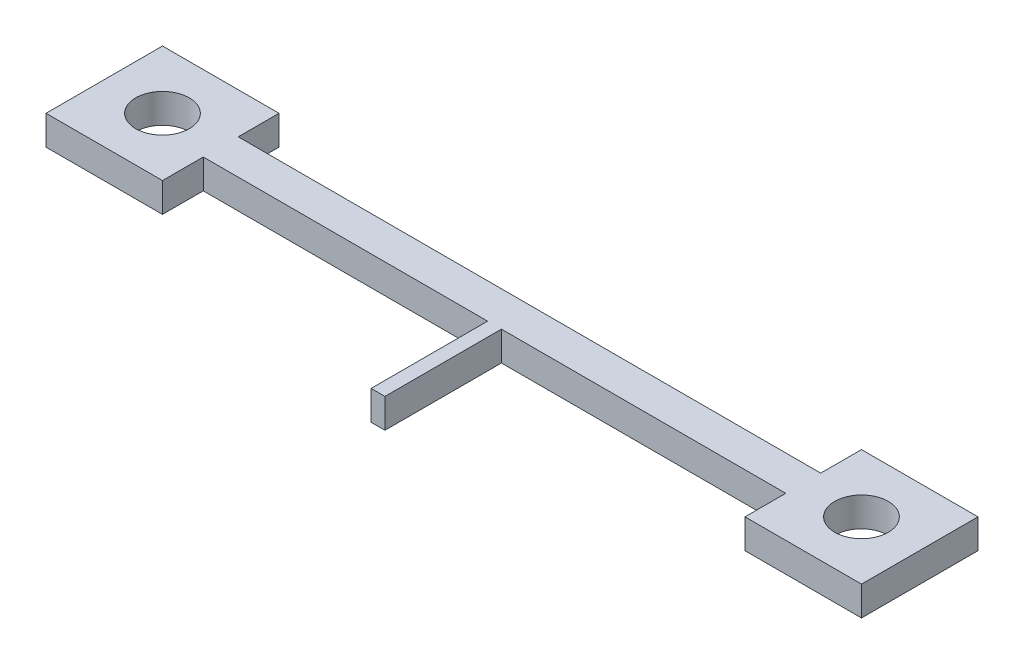
ISO-10303-21;
HEADER;
FILE_DESCRIPTION(('STEP AP214'),'2;1');
FILE_NAME('part.step','',(''),(''),'','','');
FILE_SCHEMA(('AUTOMOTIVE_DESIGN { 1 0 10303 214 1 1 1 1 }'));
ENDSEC;
DATA;
#1=APPLICATION_CONTEXT('core data for automotive mechanical design processes');
#2=APPLICATION_PROTOCOL_DEFINITION('international standard','automotive_design',2000,#1);
#3=PRODUCT_CONTEXT('',#1,'mechanical');
#4=PRODUCT('Part','Part','',(#3));
#5=PRODUCT_RELATED_PRODUCT_CATEGORY('part','',(#4));
#6=PRODUCT_DEFINITION_FORMATION('','',#4);
#7=PRODUCT_DEFINITION_CONTEXT('part definition',#1,'design');
#8=PRODUCT_DEFINITION('design','',#6,#7);
#9=PRODUCT_DEFINITION_SHAPE('','',#8);
#10=(LENGTH_UNIT() NAMED_UNIT(*) SI_UNIT(.MILLI.,.METRE.));
#11=(NAMED_UNIT(*) PLANE_ANGLE_UNIT() SI_UNIT($,.RADIAN.));
#12=(NAMED_UNIT(*) SI_UNIT($,.STERADIAN.) SOLID_ANGLE_UNIT());
#13=UNCERTAINTY_MEASURE_WITH_UNIT(LENGTH_MEASURE(1.E-05),#10,'distance_accuracy_value','');
#14=(GEOMETRIC_REPRESENTATION_CONTEXT(3) GLOBAL_UNCERTAINTY_ASSIGNED_CONTEXT((#13)) GLOBAL_UNIT_ASSIGNED_CONTEXT((#10,
#11,#12)) REPRESENTATION_CONTEXT('',''));
#15=CARTESIAN_POINT('',(0.,0.,0.));
#16=DIRECTION('',(0.,0.,1.));
#17=DIRECTION('',(1.,0.,0.));
#18=AXIS2_PLACEMENT_3D('',#15,#16,#17);
#19=CARTESIAN_POINT('',(-41.4240464845624,0.8001,10.2832594653076));
#20=DIRECTION('',(0.,0.,-1.));
#21=DIRECTION('',(-1.,0.,0.));
#22=AXIS2_PLACEMENT_3D('',#19,#20,#21);
#23=PLANE('',#22);
#24=DIRECTION('',(0.,1.,0.));
#25=VECTOR('',#24,1.);
#26=CARTESIAN_POINT('',(-25.1720464765624,0.8001,10.2832594653076));
#27=LINE('',#26,#25);
#28=CARTESIAN_POINT('',(-25.1720464765624,-0.8001,10.2832594653076));
#29=VERTEX_POINT('',#28);
#30=CARTESIAN_POINT('',(-25.1720464765624,0.8001,10.2832594653076));
#31=VERTEX_POINT('',#30);
#32=EDGE_CURVE('E499',#29,#31,#27,.T.);
#33=ORIENTED_EDGE('',*,*,#32,.F.);
#34=DIRECTION('',(1.,0.,0.));
#35=VECTOR('',#34,1.);
#36=CARTESIAN_POINT('',(-41.4240464845624,-0.8001,10.2832594653076));
#37=LINE('',#36,#35);
#38=CARTESIAN_POINT('',(-9.67404648456241,-0.8001,10.2832594653076));
#39=VERTEX_POINT('',#38);
#40=EDGE_CURVE('E181',#29,#39,#37,.T.);
#41=ORIENTED_EDGE('',*,*,#40,.T.);
#42=DIRECTION('',(0.,-1.,0.));
#43=VECTOR('',#42,1.);
#44=CARTESIAN_POINT('',(-9.67404648456241,0.8001,10.2832594653076));
#45=LINE('',#44,#43);
#46=CARTESIAN_POINT('',(-9.67404648456241,0.8001,10.2832594653076));
#47=VERTEX_POINT('',#46);
#48=EDGE_CURVE('E154',#47,#39,#45,.T.);
#49=ORIENTED_EDGE('',*,*,#48,.F.);
#50=DIRECTION('',(1.,0.,0.));
#51=VECTOR('',#50,1.);
#52=CARTESIAN_POINT('',(-41.4240464845624,0.8001,10.2832594653076));
#53=LINE('',#52,#51);
#54=EDGE_CURVE('E144',#31,#47,#53,.T.);
#55=ORIENTED_EDGE('',*,*,#54,.F.);
#56=EDGE_LOOP('',(#33,#41,#49,#55));
#57=FACE_BOUND('',#56,.T.);
#58=ADVANCED_FACE('F36',(#57),#23,.F.);
#59=CARTESIAN_POINT('',(-41.4240464845624,-0.8001,10.2832594653076));
#60=VERTEX_POINT('',#59);
#61=CARTESIAN_POINT('',(-25.9260464925624,-0.8001,10.2832594653076));
#62=VERTEX_POINT('',#61);
#63=EDGE_CURVE('E182',#60,#62,#37,.T.);
#64=ORIENTED_EDGE('',*,*,#63,.T.);
#65=DIRECTION('',(0.,-1.,0.));
#66=VECTOR('',#65,1.);
#67=CARTESIAN_POINT('',(-25.9260464925624,0.8001,10.2832594653076));
#68=LINE('',#67,#66);
#69=CARTESIAN_POINT('',(-25.9260464925624,0.8001,10.2832594653076));
#70=VERTEX_POINT('',#69);
#71=EDGE_CURVE('E258',#70,#62,#68,.T.);
#72=ORIENTED_EDGE('',*,*,#71,.F.);
#73=CARTESIAN_POINT('',(-41.4240464845624,0.8001,10.2832594653076));
#74=VERTEX_POINT('',#73);
#75=EDGE_CURVE('E148',#74,#70,#53,.T.);
#76=ORIENTED_EDGE('',*,*,#75,.F.);
#77=DIRECTION('',(0.,-1.,0.));
#78=VECTOR('',#77,1.);
#79=CARTESIAN_POINT('',(-41.4240464845624,0.8001,10.2832594653076));
#80=LINE('',#79,#78);
#81=EDGE_CURVE('E192',#74,#60,#80,.T.);
#82=ORIENTED_EDGE('',*,*,#81,.T.);
#83=EDGE_LOOP('',(#64,#72,#76,#82));
#84=FACE_BOUND('',#83,.T.);
#85=ADVANCED_FACE('F255',(#84),#23,.F.);
#86=CARTESIAN_POINT('',(-9.67404648456241,0.8001,6.15575946530759));
#87=DIRECTION('',(0.,0.,1.));
#88=DIRECTION('',(1.,0.,0.));
#89=AXIS2_PLACEMENT_3D('',#86,#87,#88);
#90=PLANE('',#89);
#91=DIRECTION('',(-1.,0.,0.));
#92=VECTOR('',#91,1.);
#93=CARTESIAN_POINT('',(-9.67404648456241,-0.8001,6.15575946530759));
#94=LINE('',#93,#92);
#95=CARTESIAN_POINT('',(-3.32404648456241,-0.8001,6.15575946530759));
#96=VERTEX_POINT('',#95);
#97=CARTESIAN_POINT('',(-9.67404648456241,-0.8001,6.15575946530759));
#98=VERTEX_POINT('',#97);
#99=EDGE_CURVE('E163',#96,#98,#94,.T.);
#100=ORIENTED_EDGE('',*,*,#99,.T.);
#101=DIRECTION('',(0.,-1.,0.));
#102=VECTOR('',#101,1.);
#103=CARTESIAN_POINT('',(-9.67404648456241,0.8001,6.15575946530759));
#104=LINE('',#103,#102);
#105=CARTESIAN_POINT('',(-9.67404648456241,0.8001,6.15575946530759));
#106=VERTEX_POINT('',#105);
#107=EDGE_CURVE('E11',#106,#98,#104,.T.);
#108=ORIENTED_EDGE('',*,*,#107,.F.);
#109=DIRECTION('',(-1.,0.,0.));
#110=VECTOR('',#109,1.);
#111=CARTESIAN_POINT('',(-9.67404648456241,0.8001,6.15575946530759));
#112=LINE('',#111,#110);
#113=CARTESIAN_POINT('',(-3.32404648456241,0.8001,6.15575946530759));
#114=VERTEX_POINT('',#113);
#115=EDGE_CURVE('E188',#114,#106,#112,.T.);
#116=ORIENTED_EDGE('',*,*,#115,.F.);
#117=DIRECTION('',(0.,-1.,0.));
#118=VECTOR('',#117,1.);
#119=CARTESIAN_POINT('',(-3.32404648456241,0.8001,6.15575946530759));
#120=LINE('',#119,#118);
#121=EDGE_CURVE('E159',#114,#96,#120,.T.);
#122=ORIENTED_EDGE('',*,*,#121,.T.);
#123=EDGE_LOOP('',(#100,#108,#116,#122));
#124=FACE_BOUND('',#123,.T.);
#125=ADVANCED_FACE('F38',(#124),#90,.F.);
#126=CARTESIAN_POINT('',(-9.67404648456241,0.8001,8.37825946530759));
#127=DIRECTION('',(1.,0.,0.));
#128=DIRECTION('',(0.,0.,-1.));
#129=AXIS2_PLACEMENT_3D('',#126,#127,#128);
#130=PLANE('',#129);
#131=DIRECTION('',(0.,0.,1.));
#132=VECTOR('',#131,1.);
#133=CARTESIAN_POINT('',(-9.67404648456241,-0.8001,8.37825946530759));
#134=LINE('',#133,#132);
#135=CARTESIAN_POINT('',(-9.67404648456241,-0.8001,8.37825946530759));
#136=VERTEX_POINT('',#135);
#137=EDGE_CURVE('E166',#98,#136,#134,.T.);
#138=ORIENTED_EDGE('',*,*,#137,.T.);
#139=DIRECTION('',(0.,-1.,0.));
#140=VECTOR('',#139,1.);
#141=CARTESIAN_POINT('',(-9.67404648456241,0.8001,8.37825946530759));
#142=LINE('',#141,#140);
#143=CARTESIAN_POINT('',(-9.67404648456241,0.8001,8.37825946530759));
#144=VERTEX_POINT('',#143);
#145=EDGE_CURVE('E45',#144,#136,#142,.T.);
#146=ORIENTED_EDGE('',*,*,#145,.F.);
#147=DIRECTION('',(0.,0.,1.));
#148=VECTOR('',#147,1.);
#149=CARTESIAN_POINT('',(-9.67404648456241,0.8001,8.37825946530759));
#150=LINE('',#149,#148);
#151=EDGE_CURVE('E109',#106,#144,#150,.T.);
#152=ORIENTED_EDGE('',*,*,#151,.F.);
#153=ORIENTED_EDGE('',*,*,#107,.T.);
#154=EDGE_LOOP('',(#138,#146,#152,#153));
#155=FACE_BOUND('',#154,.T.);
#156=ADVANCED_FACE('F296',(#155),#130,.F.);
#157=CARTESIAN_POINT('',(-41.4240464845624,0.8001,8.37825946530759));
#158=DIRECTION('',(0.,0.,1.));
#159=DIRECTION('',(1.,0.,0.));
#160=AXIS2_PLACEMENT_3D('',#157,#158,#159);
#161=PLANE('',#160);
#162=DIRECTION('',(-1.,0.,0.));
#163=VECTOR('',#162,1.);
#164=CARTESIAN_POINT('',(-41.4240464845624,-0.8001,8.37825946530759));
#165=LINE('',#164,#163);
#166=CARTESIAN_POINT('',(-41.4240464845624,-0.8001,8.37825946530759));
#167=VERTEX_POINT('',#166);
#168=EDGE_CURVE('E169',#136,#167,#165,.T.);
#169=ORIENTED_EDGE('',*,*,#168,.T.);
#170=DIRECTION('',(0.,-1.,0.));
#171=VECTOR('',#170,1.);
#172=CARTESIAN_POINT('',(-41.4240464845624,0.8001,8.37825946530759));
#173=LINE('',#172,#171);
#174=CARTESIAN_POINT('',(-41.4240464845624,0.8001,8.37825946530759));
#175=VERTEX_POINT('',#174);
#176=EDGE_CURVE('E207',#175,#167,#173,.T.);
#177=ORIENTED_EDGE('',*,*,#176,.F.);
#178=DIRECTION('',(-1.,0.,0.));
#179=VECTOR('',#178,1.);
#180=CARTESIAN_POINT('',(-41.4240464845624,0.8001,8.37825946530759));
#181=LINE('',#180,#179);
#182=EDGE_CURVE('E215',#144,#175,#181,.T.);
#183=ORIENTED_EDGE('',*,*,#182,.F.);
#184=ORIENTED_EDGE('',*,*,#145,.T.);
#185=EDGE_LOOP('',(#169,#177,#183,#184));
#186=FACE_BOUND('',#185,.T.);
#187=ADVANCED_FACE('F213',(#186),#161,.F.);
#188=CARTESIAN_POINT('',(-41.4240464845624,0.8001,8.37825946530759));
#189=DIRECTION('',(-1.,0.,0.));
#190=DIRECTION('',(0.,0.,1.));
#191=AXIS2_PLACEMENT_3D('',#188,#189,#190);
#192=PLANE('',#191);
#193=DIRECTION('',(0.,0.,-1.));
#194=VECTOR('',#193,1.);
#195=CARTESIAN_POINT('',(-41.4240464845624,-0.8001,8.37825946530759));
#196=LINE('',#195,#194);
#197=CARTESIAN_POINT('',(-41.4240464845624,-0.8001,6.15575946530758));
#198=VERTEX_POINT('',#197);
#199=EDGE_CURVE('E171',#167,#198,#196,.T.);
#200=ORIENTED_EDGE('',*,*,#199,.T.);
#201=DIRECTION('',(0.,-1.,0.));
#202=VECTOR('',#201,1.);
#203=CARTESIAN_POINT('',(-41.4240464845624,0.8001,6.15575946530758));
#204=LINE('',#203,#202);
#205=CARTESIAN_POINT('',(-41.4240464845624,0.8001,6.15575946530758));
#206=VERTEX_POINT('',#205);
#207=EDGE_CURVE('E204',#206,#198,#204,.T.);
#208=ORIENTED_EDGE('',*,*,#207,.F.);
#209=DIRECTION('',(0.,0.,-1.));
#210=VECTOR('',#209,1.);
#211=CARTESIAN_POINT('',(-41.4240464845624,0.8001,8.37825946530759));
#212=LINE('',#211,#210);
#213=EDGE_CURVE('E235',#175,#206,#212,.T.);
#214=ORIENTED_EDGE('',*,*,#213,.F.);
#215=ORIENTED_EDGE('',*,*,#176,.T.);
#216=EDGE_LOOP('',(#200,#208,#214,#215));
#217=FACE_BOUND('',#216,.T.);
#218=ADVANCED_FACE('F226',(#217),#192,.F.);
#219=CARTESIAN_POINT('',(-47.7740464845624,0.8001,6.15575946530758));
#220=DIRECTION('',(0.,0.,1.));
#221=DIRECTION('',(1.,0.,0.));
#222=AXIS2_PLACEMENT_3D('',#219,#220,#221);
#223=PLANE('',#222);
#224=DIRECTION('',(-1.,0.,0.));
#225=VECTOR('',#224,1.);
#226=CARTESIAN_POINT('',(-47.7740464845624,-0.8001,6.15575946530758));
#227=LINE('',#226,#225);
#228=CARTESIAN_POINT('',(-47.7740464845624,-0.8001,6.15575946530758));
#229=VERTEX_POINT('',#228);
#230=EDGE_CURVE('E173',#198,#229,#227,.T.);
#231=ORIENTED_EDGE('',*,*,#230,.T.);
#232=DIRECTION('',(0.,-1.,0.));
#233=VECTOR('',#232,1.);
#234=CARTESIAN_POINT('',(-47.7740464845624,0.8001,6.15575946530758));
#235=LINE('',#234,#233);
#236=CARTESIAN_POINT('',(-47.7740464845624,0.8001,6.15575946530758));
#237=VERTEX_POINT('',#236);
#238=EDGE_CURVE('E201',#237,#229,#235,.T.);
#239=ORIENTED_EDGE('',*,*,#238,.F.);
#240=DIRECTION('',(-1.,0.,0.));
#241=VECTOR('',#240,1.);
#242=CARTESIAN_POINT('',(-47.7740464845624,0.8001,6.15575946530758));
#243=LINE('',#242,#241);
#244=EDGE_CURVE('E232',#206,#237,#243,.T.);
#245=ORIENTED_EDGE('',*,*,#244,.F.);
#246=ORIENTED_EDGE('',*,*,#207,.T.);
#247=EDGE_LOOP('',(#231,#239,#245,#246));
#248=FACE_BOUND('',#247,.T.);
#249=ADVANCED_FACE('F230',(#248),#223,.F.);
#250=CARTESIAN_POINT('',(-47.7740464845624,0.8001,12.5057594653076));
#251=DIRECTION('',(1.,0.,0.));
#252=DIRECTION('',(0.,0.,-1.));
#253=AXIS2_PLACEMENT_3D('',#250,#251,#252);
#254=PLANE('',#253);
#255=DIRECTION('',(0.,0.,1.));
#256=VECTOR('',#255,1.);
#257=CARTESIAN_POINT('',(-47.7740464845624,-0.8001,12.5057594653076));
#258=LINE('',#257,#256);
#259=CARTESIAN_POINT('',(-47.7740464845624,-0.8001,12.5057594653076));
#260=VERTEX_POINT('',#259);
#261=EDGE_CURVE('E175',#229,#260,#258,.T.);
#262=ORIENTED_EDGE('',*,*,#261,.T.);
#263=DIRECTION('',(0.,-1.,0.));
#264=VECTOR('',#263,1.);
#265=CARTESIAN_POINT('',(-47.7740464845624,0.8001,12.5057594653076));
#266=LINE('',#265,#264);
#267=CARTESIAN_POINT('',(-47.7740464845624,0.8001,12.5057594653076));
#268=VERTEX_POINT('',#267);
#269=EDGE_CURVE('E198',#268,#260,#266,.T.);
#270=ORIENTED_EDGE('',*,*,#269,.F.);
#271=DIRECTION('',(0.,0.,1.));
#272=VECTOR('',#271,1.);
#273=CARTESIAN_POINT('',(-47.7740464845624,0.8001,12.5057594653076));
#274=LINE('',#273,#272);
#275=EDGE_CURVE('E234',#237,#268,#274,.T.);
#276=ORIENTED_EDGE('',*,*,#275,.F.);
#277=ORIENTED_EDGE('',*,*,#238,.T.);
#278=EDGE_LOOP('',(#262,#270,#276,#277));
#279=FACE_BOUND('',#278,.T.);
#280=ADVANCED_FACE('F320',(#279),#254,.F.);
#281=CARTESIAN_POINT('',(-47.7740464845624,0.8001,12.5057594653076));
#282=DIRECTION('',(0.,0.,-1.));
#283=DIRECTION('',(-1.,0.,0.));
#284=AXIS2_PLACEMENT_3D('',#281,#282,#283);
#285=PLANE('',#284);
#286=DIRECTION('',(1.,0.,0.));
#287=VECTOR('',#286,1.);
#288=CARTESIAN_POINT('',(-47.7740464845624,-0.8001,12.5057594653076));
#289=LINE('',#288,#287);
#290=CARTESIAN_POINT('',(-41.4240464845624,-0.8001,12.5057594653076));
#291=VERTEX_POINT('',#290);
#292=EDGE_CURVE('E177',#260,#291,#289,.T.);
#293=ORIENTED_EDGE('',*,*,#292,.T.);
#294=DIRECTION('',(0.,-1.,0.));
#295=VECTOR('',#294,1.);
#296=CARTESIAN_POINT('',(-41.4240464845624,0.8001,12.5057594653076));
#297=LINE('',#296,#295);
#298=CARTESIAN_POINT('',(-41.4240464845624,0.8001,12.5057594653076));
#299=VERTEX_POINT('',#298);
#300=EDGE_CURVE('E195',#299,#291,#297,.T.);
#301=ORIENTED_EDGE('',*,*,#300,.F.);
#302=DIRECTION('',(1.,0.,0.));
#303=VECTOR('',#302,1.);
#304=CARTESIAN_POINT('',(-47.7740464845624,0.8001,12.5057594653076));
#305=LINE('',#304,#303);
#306=EDGE_CURVE('E237',#268,#299,#305,.T.);
#307=ORIENTED_EDGE('',*,*,#306,.F.);
#308=ORIENTED_EDGE('',*,*,#269,.T.);
#309=EDGE_LOOP('',(#293,#301,#307,#308));
#310=FACE_BOUND('',#309,.T.);
#311=ADVANCED_FACE('F316',(#310),#285,.F.);
#312=CARTESIAN_POINT('',(-41.4240464845624,0.8001,10.2832594653076));
#313=DIRECTION('',(-1.,0.,0.));
#314=DIRECTION('',(0.,0.,1.));
#315=AXIS2_PLACEMENT_3D('',#312,#313,#314);
#316=PLANE('',#315);
#317=DIRECTION('',(0.,0.,-1.));
#318=VECTOR('',#317,1.);
#319=CARTESIAN_POINT('',(-41.4240464845624,-0.8001,10.2832594653076));
#320=LINE('',#319,#318);
#321=EDGE_CURVE('E179',#291,#60,#320,.T.);
#322=ORIENTED_EDGE('',*,*,#321,.T.);
#323=ORIENTED_EDGE('',*,*,#81,.F.);
#324=DIRECTION('',(0.,0.,-1.));
#325=VECTOR('',#324,1.);
#326=CARTESIAN_POINT('',(-41.4240464845624,0.8001,10.2832594653076));
#327=LINE('',#326,#325);
#328=EDGE_CURVE('E243',#299,#74,#327,.T.);
#329=ORIENTED_EDGE('',*,*,#328,.F.);
#330=ORIENTED_EDGE('',*,*,#300,.T.);
#331=EDGE_LOOP('',(#322,#323,#329,#330));
#332=FACE_BOUND('',#331,.T.);
#333=ADVANCED_FACE('F313',(#332),#316,.F.);
#334=CARTESIAN_POINT('',(-9.67404648456241,0.8001,10.2832594653076));
#335=DIRECTION('',(1.,0.,0.));
#336=DIRECTION('',(0.,0.,-1.));
#337=AXIS2_PLACEMENT_3D('',#334,#335,#336);
#338=PLANE('',#337);
#339=DIRECTION('',(0.,0.,1.));
#340=VECTOR('',#339,1.);
#341=CARTESIAN_POINT('',(-9.67404648456241,-0.8001,10.2832594653076));
#342=LINE('',#341,#340);
#343=CARTESIAN_POINT('',(-9.67404648456241,-0.8001,12.5057594653076));
#344=VERTEX_POINT('',#343);
#345=EDGE_CURVE('E153',#39,#344,#342,.T.);
#346=ORIENTED_EDGE('',*,*,#345,.T.);
#347=DIRECTION('',(0.,-1.,0.));
#348=VECTOR('',#347,1.);
#349=CARTESIAN_POINT('',(-9.67404648456241,0.8001,12.5057594653076));
#350=LINE('',#349,#348);
#351=CARTESIAN_POINT('',(-9.67404648456241,0.8001,12.5057594653076));
#352=VERTEX_POINT('',#351);
#353=EDGE_CURVE('E150',#352,#344,#350,.T.);
#354=ORIENTED_EDGE('',*,*,#353,.F.);
#355=DIRECTION('',(0.,0.,1.));
#356=VECTOR('',#355,1.);
#357=CARTESIAN_POINT('',(-9.67404648456241,0.8001,10.2832594653076));
#358=LINE('',#357,#356);
#359=EDGE_CURVE('E136',#47,#352,#358,.T.);
#360=ORIENTED_EDGE('',*,*,#359,.F.);
#361=ORIENTED_EDGE('',*,*,#48,.T.);
#362=EDGE_LOOP('',(#346,#354,#360,#361));
#363=FACE_BOUND('',#362,.T.);
#364=ADVANCED_FACE('F151',(#363),#338,.F.);
#365=CARTESIAN_POINT('',(-9.67404648456241,0.8001,12.5057594653076));
#366=DIRECTION('',(0.,0.,-1.));
#367=DIRECTION('',(-1.,0.,0.));
#368=AXIS2_PLACEMENT_3D('',#365,#366,#367);
#369=PLANE('',#368);
#370=DIRECTION('',(1.,0.,0.));
#371=VECTOR('',#370,1.);
#372=CARTESIAN_POINT('',(-9.67404648456241,-0.8001,12.5057594653076));
#373=LINE('',#372,#371);
#374=CARTESIAN_POINT('',(-3.32404648456241,-0.8001,12.5057594653076));
#375=VERTEX_POINT('',#374);
#376=EDGE_CURVE('E95',#344,#375,#373,.T.);
#377=ORIENTED_EDGE('',*,*,#376,.T.);
#378=DIRECTION('',(0.,-1.,0.));
#379=VECTOR('',#378,1.);
#380=CARTESIAN_POINT('',(-3.32404648456241,0.8001,12.5057594653076));
#381=LINE('',#380,#379);
#382=CARTESIAN_POINT('',(-3.32404648456241,0.8001,12.5057594653076));
#383=VERTEX_POINT('',#382);
#384=EDGE_CURVE('E155',#383,#375,#381,.T.);
#385=ORIENTED_EDGE('',*,*,#384,.F.);
#386=DIRECTION('',(1.,0.,0.));
#387=VECTOR('',#386,1.);
#388=CARTESIAN_POINT('',(-9.67404648456241,0.8001,12.5057594653076));
#389=LINE('',#388,#387);
#390=EDGE_CURVE('E142',#352,#383,#389,.T.);
#391=ORIENTED_EDGE('',*,*,#390,.F.);
#392=ORIENTED_EDGE('',*,*,#353,.T.);
#393=EDGE_LOOP('',(#377,#385,#391,#392));
#394=FACE_BOUND('',#393,.T.);
#395=ADVANCED_FACE('F157',(#394),#369,.F.);
#396=CARTESIAN_POINT('',(-3.32404648456241,0.8001,12.5057594653076));
#397=DIRECTION('',(-1.,0.,0.));
#398=DIRECTION('',(0.,0.,1.));
#399=AXIS2_PLACEMENT_3D('',#396,#397,#398);
#400=PLANE('',#399);
#401=DIRECTION('',(0.,0.,-1.));
#402=VECTOR('',#401,1.);
#403=CARTESIAN_POINT('',(-3.32404648456241,-0.8001,12.5057594653076));
#404=LINE('',#403,#402);
#405=EDGE_CURVE('E101',#375,#96,#404,.T.);
#406=ORIENTED_EDGE('',*,*,#405,.T.);
#407=ORIENTED_EDGE('',*,*,#121,.F.);
#408=DIRECTION('',(0.,0.,-1.));
#409=VECTOR('',#408,1.);
#410=CARTESIAN_POINT('',(-3.32404648456241,0.8001,12.5057594653076));
#411=LINE('',#410,#409);
#412=EDGE_CURVE('E53',#383,#114,#411,.T.);
#413=ORIENTED_EDGE('',*,*,#412,.F.);
#414=ORIENTED_EDGE('',*,*,#384,.T.);
#415=EDGE_LOOP('',(#406,#407,#413,#414));
#416=FACE_BOUND('',#415,.T.);
#417=ADVANCED_FACE('F359',(#416),#400,.F.);
#418=CARTESIAN_POINT('',(-3.32404648456241,0.8001,6.15575946530759));
#419=DIRECTION('',(0.,1.,0.));
#420=DIRECTION('',(0.,0.,1.));
#421=AXIS2_PLACEMENT_3D('',#418,#419,#420);
#422=PLANE('',#421);
#423=DIRECTION('',(0.,0.,1.));
#424=VECTOR('',#423,1.);
#425=CARTESIAN_POINT('',(-25.1720464765624,0.8001,10.2832594653076));
#426=LINE('',#425,#424);
#427=CARTESIAN_POINT('',(-25.1720464765624,0.8001,16.6332594653076));
#428=VERTEX_POINT('',#427);
#429=EDGE_CURVE('E502',#31,#428,#426,.T.);
#430=ORIENTED_EDGE('',*,*,#429,.F.);
#431=ORIENTED_EDGE('',*,*,#54,.T.);
#432=ORIENTED_EDGE('',*,*,#359,.T.);
#433=ORIENTED_EDGE('',*,*,#390,.T.);
#434=ORIENTED_EDGE('',*,*,#412,.T.);
#435=ORIENTED_EDGE('',*,*,#115,.T.);
#436=ORIENTED_EDGE('',*,*,#151,.T.);
#437=ORIENTED_EDGE('',*,*,#182,.T.);
#438=ORIENTED_EDGE('',*,*,#213,.T.);
#439=ORIENTED_EDGE('',*,*,#244,.T.);
#440=ORIENTED_EDGE('',*,*,#275,.T.);
#441=ORIENTED_EDGE('',*,*,#306,.T.);
#442=ORIENTED_EDGE('',*,*,#328,.T.);
#443=ORIENTED_EDGE('',*,*,#75,.T.);
#444=DIRECTION('',(0.,0.,-1.));
#445=VECTOR('',#444,1.);
#446=CARTESIAN_POINT('',(-25.9260464925624,0.8001,10.2832594653076));
#447=LINE('',#446,#445);
#448=CARTESIAN_POINT('',(-25.9260464925624,0.8001,16.6332594653076));
#449=VERTEX_POINT('',#448);
#450=EDGE_CURVE('E250',#449,#70,#447,.T.);
#451=ORIENTED_EDGE('',*,*,#450,.F.);
#452=DIRECTION('',(-1.,0.,0.));
#453=VECTOR('',#452,1.);
#454=CARTESIAN_POINT('',(-25.7990464925624,0.8001,16.6332594653076));
#455=LINE('',#454,#453);
#456=EDGE_CURVE('E278',#428,#449,#455,.T.);
#457=ORIENTED_EDGE('',*,*,#456,.F.);
#458=EDGE_LOOP('',(#430,#431,#432,#433,#434,#435,#436,#437,#438,#439,#440,#441,#442,#443,#451,#457));
#459=FACE_BOUND('',#458,.T.);
#460=CARTESIAN_POINT('',(-6.49904648456241,0.8001,9.33075946530758));
#461=DIRECTION('',(0.,1.,0.));
#462=DIRECTION('',(0.,0.,1.));
#463=AXIS2_PLACEMENT_3D('',#460,#461,#462);
#464=CIRCLE('',#463,1.4605);
#465=CARTESIAN_POINT('',(-6.49904648456241,0.8001,10.7912594653076));
#466=VERTEX_POINT('',#465);
#467=EDGE_CURVE('E281',#466,#466,#464,.T.);
#468=ORIENTED_EDGE('',*,*,#467,.F.);
#469=EDGE_LOOP('',(#468));
#470=FACE_BOUND('',#469,.T.);
#471=CARTESIAN_POINT('',(-44.5990464845624,0.8001,9.33075946530758));
#472=DIRECTION('',(0.,1.,0.));
#473=DIRECTION('',(0.,0.,1.));
#474=AXIS2_PLACEMENT_3D('',#471,#472,#473);
#475=CIRCLE('',#474,1.4605);
#476=CARTESIAN_POINT('',(-44.5990464845624,0.8001,10.7912594653076));
#477=VERTEX_POINT('',#476);
#478=EDGE_CURVE('E287',#477,#477,#475,.T.);
#479=ORIENTED_EDGE('',*,*,#478,.F.);
#480=EDGE_LOOP('',(#479));
#481=FACE_BOUND('',#480,.T.);
#482=ADVANCED_FACE('F139',(#459,#470,#481),#422,.T.);
#483=CARTESIAN_POINT('',(-3.32404648456241,-0.8001,6.15575946530759));
#484=DIRECTION('',(0.,1.,0.));
#485=DIRECTION('',(0.,0.,1.));
#486=AXIS2_PLACEMENT_3D('',#483,#484,#485);
#487=PLANE('',#486);
#488=ORIENTED_EDGE('',*,*,#40,.F.);
#489=DIRECTION('',(0.,0.,-1.));
#490=VECTOR('',#489,1.);
#491=CARTESIAN_POINT('',(-25.1720464765624,-0.8001,10.2832594653076));
#492=LINE('',#491,#490);
#493=CARTESIAN_POINT('',(-25.1720464765624,-0.8001,16.6332594653076));
#494=VERTEX_POINT('',#493);
#495=EDGE_CURVE('E263',#494,#29,#492,.T.);
#496=ORIENTED_EDGE('',*,*,#495,.F.);
#497=DIRECTION('',(1.,0.,0.));
#498=VECTOR('',#497,1.);
#499=CARTESIAN_POINT('',(-25.2990464765624,-0.8001,16.6332594653076));
#500=LINE('',#499,#498);
#501=CARTESIAN_POINT('',(-25.9260464925624,-0.8001,16.6332594653076));
#502=VERTEX_POINT('',#501);
#503=EDGE_CURVE('E275',#502,#494,#500,.T.);
#504=ORIENTED_EDGE('',*,*,#503,.F.);
#505=DIRECTION('',(0.,0.,1.));
#506=VECTOR('',#505,1.);
#507=CARTESIAN_POINT('',(-25.9260464925624,-0.8001,10.2832594653076));
#508=LINE('',#507,#506);
#509=EDGE_CURVE('E262',#62,#502,#508,.T.);
#510=ORIENTED_EDGE('',*,*,#509,.F.);
#511=ORIENTED_EDGE('',*,*,#63,.F.);
#512=ORIENTED_EDGE('',*,*,#321,.F.);
#513=ORIENTED_EDGE('',*,*,#292,.F.);
#514=ORIENTED_EDGE('',*,*,#261,.F.);
#515=ORIENTED_EDGE('',*,*,#230,.F.);
#516=ORIENTED_EDGE('',*,*,#199,.F.);
#517=ORIENTED_EDGE('',*,*,#168,.F.);
#518=ORIENTED_EDGE('',*,*,#137,.F.);
#519=ORIENTED_EDGE('',*,*,#99,.F.);
#520=ORIENTED_EDGE('',*,*,#405,.F.);
#521=ORIENTED_EDGE('',*,*,#376,.F.);
#522=ORIENTED_EDGE('',*,*,#345,.F.);
#523=EDGE_LOOP('',(#488,#496,#504,#510,#511,#512,#513,#514,#515,#516,#517,#518,#519,#520,#521,#522));
#524=FACE_BOUND('',#523,.T.);
#525=CARTESIAN_POINT('',(-6.49904648456241,-0.8001,9.33075946530758));
#526=DIRECTION('',(0.,1.,0.));
#527=DIRECTION('',(0.,0.,1.));
#528=AXIS2_PLACEMENT_3D('',#525,#526,#527);
#529=CIRCLE('',#528,1.4605);
#530=CARTESIAN_POINT('',(-6.49904648456241,-0.8001,10.7912594653076));
#531=VERTEX_POINT('',#530);
#532=EDGE_CURVE('E284',#531,#531,#529,.T.);
#533=ORIENTED_EDGE('',*,*,#532,.T.);
#534=EDGE_LOOP('',(#533));
#535=FACE_BOUND('',#534,.T.);
#536=CARTESIAN_POINT('',(-44.5990464845624,-0.8001,9.33075946530758));
#537=DIRECTION('',(0.,1.,0.));
#538=DIRECTION('',(0.,0.,1.));
#539=AXIS2_PLACEMENT_3D('',#536,#537,#538);
#540=CIRCLE('',#539,1.4605);
#541=CARTESIAN_POINT('',(-44.5990464845624,-0.8001,10.7912594653076));
#542=VERTEX_POINT('',#541);
#543=EDGE_CURVE('E167',#542,#542,#540,.T.);
#544=ORIENTED_EDGE('',*,*,#543,.T.);
#545=EDGE_LOOP('',(#544));
#546=FACE_BOUND('',#545,.T.);
#547=ADVANCED_FACE('F219',(#524,#535,#546),#487,.F.);
#548=CARTESIAN_POINT('',(-44.5990464845624,0.8001,9.33075946530758));
#549=DIRECTION('',(0.,1.,0.));
#550=DIRECTION('',(0.,0.,1.));
#551=AXIS2_PLACEMENT_3D('',#548,#549,#550);
#552=CYLINDRICAL_SURFACE('',#551,1.4605);
#553=ORIENTED_EDGE('',*,*,#543,.F.);
#554=EDGE_LOOP('',(#553));
#555=FACE_BOUND('',#554,.T.);
#556=ORIENTED_EDGE('',*,*,#478,.T.);
#557=EDGE_LOOP('',(#556));
#558=FACE_BOUND('',#557,.T.);
#559=ADVANCED_FACE('F378',(#555,#558),#552,.F.);
#560=CARTESIAN_POINT('',(-6.49904648456241,0.8001,9.33075946530758));
#561=DIRECTION('',(0.,1.,0.));
#562=DIRECTION('',(0.,0.,1.));
#563=AXIS2_PLACEMENT_3D('',#560,#561,#562);
#564=CYLINDRICAL_SURFACE('',#563,1.4605);
#565=ORIENTED_EDGE('',*,*,#532,.F.);
#566=EDGE_LOOP('',(#565));
#567=FACE_BOUND('',#566,.T.);
#568=ORIENTED_EDGE('',*,*,#467,.T.);
#569=EDGE_LOOP('',(#568));
#570=FACE_BOUND('',#569,.T.);
#571=ADVANCED_FACE('F385',(#567,#570),#564,.F.);
#572=CARTESIAN_POINT('',(0.,0.,16.6332594653076));
#573=DIRECTION('',(0.,0.,-1.));
#574=DIRECTION('',(-1.,0.,0.));
#575=AXIS2_PLACEMENT_3D('',#572,#573,#574);
#576=PLANE('',#575);
#577=ORIENTED_EDGE('',*,*,#456,.T.);
#578=DIRECTION('',(0.,1.,0.));
#579=VECTOR('',#578,1.);
#580=CARTESIAN_POINT('',(-25.9260464925624,0.8001,16.6332594653076));
#581=LINE('',#580,#579);
#582=EDGE_CURVE('E265',#502,#449,#581,.T.);
#583=ORIENTED_EDGE('',*,*,#582,.F.);
#584=ORIENTED_EDGE('',*,*,#503,.T.);
#585=DIRECTION('',(0.,-1.,0.));
#586=VECTOR('',#585,1.);
#587=CARTESIAN_POINT('',(-25.1720464765624,0.8001,16.6332594653076));
#588=LINE('',#587,#586);
#589=EDGE_CURVE('E268',#428,#494,#588,.T.);
#590=ORIENTED_EDGE('',*,*,#589,.F.);
#591=EDGE_LOOP('',(#577,#583,#584,#590));
#592=FACE_BOUND('',#591,.T.);
#593=ADVANCED_FACE('F393',(#592),#576,.F.);
#594=CARTESIAN_POINT('',(-25.9260464925624,0.,0.));
#595=DIRECTION('',(-1.,0.,0.));
#596=DIRECTION('',(0.,0.,1.));
#597=AXIS2_PLACEMENT_3D('',#594,#595,#596);
#598=PLANE('',#597);
#599=ORIENTED_EDGE('',*,*,#71,.T.);
#600=ORIENTED_EDGE('',*,*,#509,.T.);
#601=ORIENTED_EDGE('',*,*,#582,.T.);
#602=ORIENTED_EDGE('',*,*,#450,.T.);
#603=EDGE_LOOP('',(#599,#600,#601,#602));
#604=FACE_BOUND('',#603,.T.);
#605=ADVANCED_FACE('F401',(#604),#598,.T.);
#606=CARTESIAN_POINT('',(-25.1720464765624,0.,0.));
#607=DIRECTION('',(-1.,0.,0.));
#608=DIRECTION('',(0.,0.,1.));
#609=AXIS2_PLACEMENT_3D('',#606,#607,#608);
#610=PLANE('',#609);
#611=ORIENTED_EDGE('',*,*,#32,.T.);
#612=ORIENTED_EDGE('',*,*,#429,.T.);
#613=ORIENTED_EDGE('',*,*,#589,.T.);
#614=ORIENTED_EDGE('',*,*,#495,.T.);
#615=EDGE_LOOP('',(#611,#612,#613,#614));
#616=FACE_BOUND('',#615,.T.);
#617=ADVANCED_FACE('F410',(#616),#610,.F.);
#618=CLOSED_SHELL('',(#58,#85,#125,#156,#187,#218,#249,#280,#311,#333,#364,#395,#417,#482,#547,
#559,#571,#593,#605,#617));
#619=MANIFOLD_SOLID_BREP('B2',#618);
#620=ADVANCED_BREP_SHAPE_REPRESENTATION('',(#18,#619),#14);
#621=SHAPE_DEFINITION_REPRESENTATION(#9,#620);
ENDSEC;
END-ISO-10303-21;
